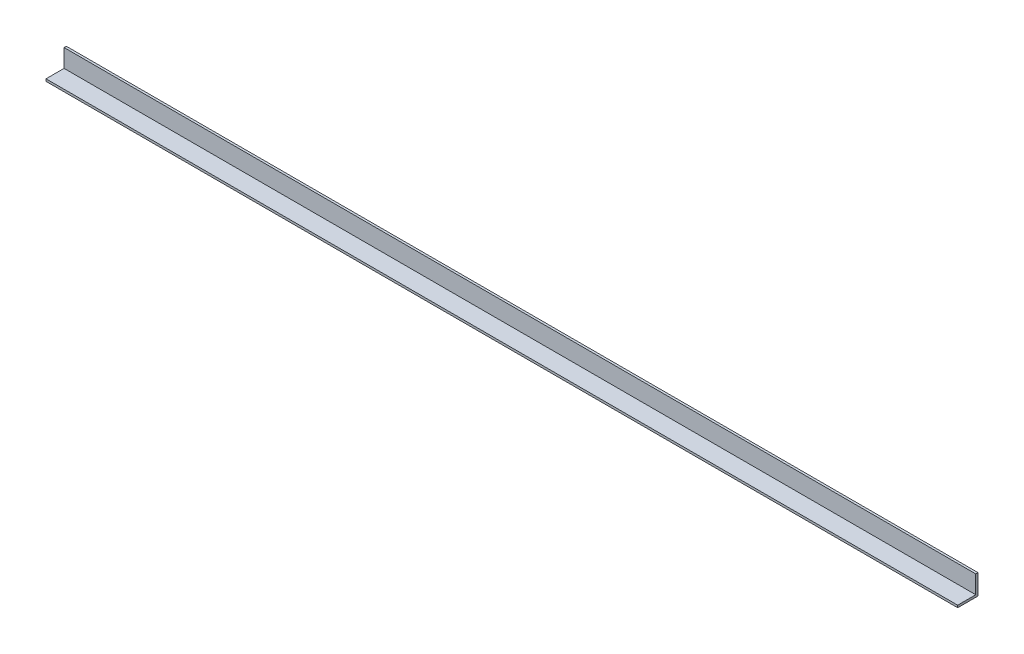
ISO-10303-21;
HEADER;
FILE_DESCRIPTION(('STEP AP214'),'2;1');
FILE_NAME('part.step','',(''),(''),'','','');
FILE_SCHEMA(('AUTOMOTIVE_DESIGN { 1 0 10303 214 1 1 1 1 }'));
ENDSEC;
DATA;
#1=APPLICATION_CONTEXT('core data for automotive mechanical design processes');
#2=APPLICATION_PROTOCOL_DEFINITION('international standard','automotive_design',2000,#1);
#3=PRODUCT_CONTEXT('',#1,'mechanical');
#4=PRODUCT('Part','Part','',(#3));
#5=PRODUCT_RELATED_PRODUCT_CATEGORY('part','',(#4));
#6=PRODUCT_DEFINITION_FORMATION('','',#4);
#7=PRODUCT_DEFINITION_CONTEXT('part definition',#1,'design');
#8=PRODUCT_DEFINITION('design','',#6,#7);
#9=PRODUCT_DEFINITION_SHAPE('','',#8);
#10=(LENGTH_UNIT() NAMED_UNIT(*) SI_UNIT(.MILLI.,.METRE.));
#11=(NAMED_UNIT(*) PLANE_ANGLE_UNIT() SI_UNIT($,.RADIAN.));
#12=(NAMED_UNIT(*) SI_UNIT($,.STERADIAN.) SOLID_ANGLE_UNIT());
#13=UNCERTAINTY_MEASURE_WITH_UNIT(LENGTH_MEASURE(1.E-05),#10,'distance_accuracy_value','');
#14=(GEOMETRIC_REPRESENTATION_CONTEXT(3) GLOBAL_UNCERTAINTY_ASSIGNED_CONTEXT((#13)) GLOBAL_UNIT_ASSIGNED_CONTEXT((#10,
#11,#12)) REPRESENTATION_CONTEXT('',''));
#15=CARTESIAN_POINT('',(0.,0.,0.));
#16=DIRECTION('',(0.,0.,1.));
#17=DIRECTION('',(1.,0.,0.));
#18=AXIS2_PLACEMENT_3D('',#15,#16,#17);
#19=CARTESIAN_POINT('',(505.,2.5,-11.25));
#20=DIRECTION('',(-1.,0.,0.));
#21=DIRECTION('',(0.,0.,1.));
#22=AXIS2_PLACEMENT_3D('',#19,#20,#21);
#23=PLANE('',#22);
#24=DIRECTION('',(0.,0.,-1.));
#25=VECTOR('',#24,1.);
#26=CARTESIAN_POINT('',(505.,0.,-11.25));
#27=LINE('',#26,#25);
#28=CARTESIAN_POINT('',(505.,0.,11.25));
#29=VERTEX_POINT('',#28);
#30=CARTESIAN_POINT('',(505.,0.,-11.25));
#31=VERTEX_POINT('',#30);
#32=EDGE_CURVE('E88',#29,#31,#27,.T.);
#33=ORIENTED_EDGE('',*,*,#32,.T.);
#34=DIRECTION('',(0.,-1.,0.));
#35=VECTOR('',#34,1.);
#36=CARTESIAN_POINT('',(505.,2.5,-11.25));
#37=LINE('',#36,#35);
#38=CARTESIAN_POINT('',(505.,22.5,-11.25));
#39=VERTEX_POINT('',#38);
#40=EDGE_CURVE('E11',#39,#31,#37,.T.);
#41=ORIENTED_EDGE('',*,*,#40,.F.);
#42=DIRECTION('',(0.,0.,-1.));
#43=VECTOR('',#42,1.);
#44=CARTESIAN_POINT('',(505.,22.5,-11.25));
#45=LINE('',#44,#43);
#46=CARTESIAN_POINT('',(505.,22.5,-8.75));
#47=VERTEX_POINT('',#46);
#48=EDGE_CURVE('E124',#47,#39,#45,.T.);
#49=ORIENTED_EDGE('',*,*,#48,.F.);
#50=DIRECTION('',(0.,-1.,0.));
#51=VECTOR('',#50,1.);
#52=CARTESIAN_POINT('',(505.,22.5,-8.75));
#53=LINE('',#52,#51);
#54=CARTESIAN_POINT('',(505.,2.5,-8.75));
#55=VERTEX_POINT('',#54);
#56=EDGE_CURVE('E97',#47,#55,#53,.T.);
#57=ORIENTED_EDGE('',*,*,#56,.T.);
#58=DIRECTION('',(0.,0.,-1.));
#59=VECTOR('',#58,1.);
#60=CARTESIAN_POINT('',(505.,2.5,-11.25));
#61=LINE('',#60,#59);
#62=CARTESIAN_POINT('',(505.,2.5,11.25));
#63=VERTEX_POINT('',#62);
#64=EDGE_CURVE('E82',#63,#55,#61,.T.);
#65=ORIENTED_EDGE('',*,*,#64,.F.);
#66=DIRECTION('',(0.,-1.,0.));
#67=VECTOR('',#66,1.);
#68=CARTESIAN_POINT('',(505.,2.5,11.25));
#69=LINE('',#68,#67);
#70=EDGE_CURVE('E75',#63,#29,#69,.T.);
#71=ORIENTED_EDGE('',*,*,#70,.T.);
#72=EDGE_LOOP('',(#33,#41,#49,#57,#65,#71));
#73=FACE_BOUND('',#72,.T.);
#74=ADVANCED_FACE('F33',(#73),#23,.F.);
#75=CARTESIAN_POINT('',(-505.,2.5,-11.25));
#76=DIRECTION('',(0.,0.,1.));
#77=DIRECTION('',(1.,0.,0.));
#78=AXIS2_PLACEMENT_3D('',#75,#76,#77);
#79=PLANE('',#78);
#80=DIRECTION('',(-1.,0.,0.));
#81=VECTOR('',#80,1.);
#82=CARTESIAN_POINT('',(-505.,0.,-11.25));
#83=LINE('',#82,#81);
#84=CARTESIAN_POINT('',(-505.,0.,-11.25));
#85=VERTEX_POINT('',#84);
#86=EDGE_CURVE('E92',#31,#85,#83,.T.);
#87=ORIENTED_EDGE('',*,*,#86,.T.);
#88=DIRECTION('',(0.,-1.,0.));
#89=VECTOR('',#88,1.);
#90=CARTESIAN_POINT('',(-505.,2.5,-11.25));
#91=LINE('',#90,#89);
#92=CARTESIAN_POINT('',(-505.,22.5,-11.25));
#93=VERTEX_POINT('',#92);
#94=EDGE_CURVE('E40',#93,#85,#91,.T.);
#95=ORIENTED_EDGE('',*,*,#94,.F.);
#96=DIRECTION('',(-1.,0.,0.));
#97=VECTOR('',#96,1.);
#98=CARTESIAN_POINT('',(-505.,22.5,-11.25));
#99=LINE('',#98,#97);
#100=EDGE_CURVE('E116',#39,#93,#99,.T.);
#101=ORIENTED_EDGE('',*,*,#100,.F.);
#102=ORIENTED_EDGE('',*,*,#40,.T.);
#103=EDGE_LOOP('',(#87,#95,#101,#102));
#104=FACE_BOUND('',#103,.T.);
#105=ADVANCED_FACE('F114',(#104),#79,.F.);
#106=CARTESIAN_POINT('',(-505.,2.5,-11.25));
#107=DIRECTION('',(1.,0.,0.));
#108=DIRECTION('',(0.,0.,-1.));
#109=AXIS2_PLACEMENT_3D('',#106,#107,#108);
#110=PLANE('',#109);
#111=DIRECTION('',(0.,0.,1.));
#112=VECTOR('',#111,1.);
#113=CARTESIAN_POINT('',(-505.,0.,-11.25));
#114=LINE('',#113,#112);
#115=CARTESIAN_POINT('',(-505.,0.,11.25));
#116=VERTEX_POINT('',#115);
#117=EDGE_CURVE('E83',#85,#116,#114,.T.);
#118=ORIENTED_EDGE('',*,*,#117,.T.);
#119=DIRECTION('',(0.,-1.,0.));
#120=VECTOR('',#119,1.);
#121=CARTESIAN_POINT('',(-505.,2.5,11.25));
#122=LINE('',#121,#120);
#123=CARTESIAN_POINT('',(-505.,2.5,11.25));
#124=VERTEX_POINT('',#123);
#125=EDGE_CURVE('E78',#124,#116,#122,.T.);
#126=ORIENTED_EDGE('',*,*,#125,.F.);
#127=DIRECTION('',(0.,0.,1.));
#128=VECTOR('',#127,1.);
#129=CARTESIAN_POINT('',(-505.,2.5,-11.25));
#130=LINE('',#129,#128);
#131=CARTESIAN_POINT('',(-505.,2.5,-8.75));
#132=VERTEX_POINT('',#131);
#133=EDGE_CURVE('E132',#132,#124,#130,.T.);
#134=ORIENTED_EDGE('',*,*,#133,.F.);
#135=DIRECTION('',(0.,-1.,0.));
#136=VECTOR('',#135,1.);
#137=CARTESIAN_POINT('',(-505.,22.5,-8.75));
#138=LINE('',#137,#136);
#139=CARTESIAN_POINT('',(-505.,22.5,-8.75));
#140=VERTEX_POINT('',#139);
#141=EDGE_CURVE('E93',#140,#132,#138,.T.);
#142=ORIENTED_EDGE('',*,*,#141,.F.);
#143=DIRECTION('',(0.,0.,1.));
#144=VECTOR('',#143,1.);
#145=CARTESIAN_POINT('',(-505.,22.5,-11.25));
#146=LINE('',#145,#144);
#147=EDGE_CURVE('E110',#93,#140,#146,.T.);
#148=ORIENTED_EDGE('',*,*,#147,.F.);
#149=ORIENTED_EDGE('',*,*,#94,.T.);
#150=EDGE_LOOP('',(#118,#126,#134,#142,#148,#149));
#151=FACE_BOUND('',#150,.T.);
#152=ADVANCED_FACE('F107',(#151),#110,.F.);
#153=CARTESIAN_POINT('',(-505.,2.5,11.25));
#154=DIRECTION('',(0.,0.,-1.));
#155=DIRECTION('',(-1.,0.,0.));
#156=AXIS2_PLACEMENT_3D('',#153,#154,#155);
#157=PLANE('',#156);
#158=DIRECTION('',(1.,0.,0.));
#159=VECTOR('',#158,1.);
#160=CARTESIAN_POINT('',(-505.,0.,11.25));
#161=LINE('',#160,#159);
#162=EDGE_CURVE('E72',#116,#29,#161,.T.);
#163=ORIENTED_EDGE('',*,*,#162,.T.);
#164=ORIENTED_EDGE('',*,*,#70,.F.);
#165=DIRECTION('',(1.,0.,0.));
#166=VECTOR('',#165,1.);
#167=CARTESIAN_POINT('',(-505.,2.5,11.25));
#168=LINE('',#167,#166);
#169=EDGE_CURVE('E53',#124,#63,#168,.T.);
#170=ORIENTED_EDGE('',*,*,#169,.F.);
#171=ORIENTED_EDGE('',*,*,#125,.T.);
#172=EDGE_LOOP('',(#163,#164,#170,#171));
#173=FACE_BOUND('',#172,.T.);
#174=ADVANCED_FACE('F74',(#173),#157,.F.);
#175=CARTESIAN_POINT('',(0.,2.5,0.));
#176=DIRECTION('',(0.,1.,0.));
#177=DIRECTION('',(0.,0.,1.));
#178=AXIS2_PLACEMENT_3D('',#175,#176,#177);
#179=PLANE('',#178);
#180=DIRECTION('',(1.,0.,0.));
#181=VECTOR('',#180,1.);
#182=CARTESIAN_POINT('',(-505.,2.5,-8.75));
#183=LINE('',#182,#181);
#184=EDGE_CURVE('E47',#132,#55,#183,.T.);
#185=ORIENTED_EDGE('',*,*,#184,.F.);
#186=ORIENTED_EDGE('',*,*,#133,.T.);
#187=ORIENTED_EDGE('',*,*,#169,.T.);
#188=ORIENTED_EDGE('',*,*,#64,.T.);
#189=EDGE_LOOP('',(#185,#186,#187,#188));
#190=FACE_BOUND('',#189,.T.);
#191=ADVANCED_FACE('F133',(#190),#179,.T.);
#192=CARTESIAN_POINT('',(0.,0.,0.));
#193=DIRECTION('',(0.,1.,0.));
#194=DIRECTION('',(0.,0.,1.));
#195=AXIS2_PLACEMENT_3D('',#192,#193,#194);
#196=PLANE('',#195);
#197=ORIENTED_EDGE('',*,*,#32,.F.);
#198=ORIENTED_EDGE('',*,*,#162,.F.);
#199=ORIENTED_EDGE('',*,*,#117,.F.);
#200=ORIENTED_EDGE('',*,*,#86,.F.);
#201=EDGE_LOOP('',(#197,#198,#199,#200));
#202=FACE_BOUND('',#201,.T.);
#203=ADVANCED_FACE('F91',(#202),#196,.F.);
#204=CARTESIAN_POINT('',(-505.,22.5,-8.75));
#205=DIRECTION('',(0.,0.,-1.));
#206=DIRECTION('',(-1.,0.,0.));
#207=AXIS2_PLACEMENT_3D('',#204,#205,#206);
#208=PLANE('',#207);
#209=ORIENTED_EDGE('',*,*,#184,.T.);
#210=ORIENTED_EDGE('',*,*,#56,.F.);
#211=DIRECTION('',(1.,0.,0.));
#212=VECTOR('',#211,1.);
#213=CARTESIAN_POINT('',(-505.,22.5,-8.75));
#214=LINE('',#213,#212);
#215=EDGE_CURVE('E127',#140,#47,#214,.T.);
#216=ORIENTED_EDGE('',*,*,#215,.F.);
#217=ORIENTED_EDGE('',*,*,#141,.T.);
#218=EDGE_LOOP('',(#209,#210,#216,#217));
#219=FACE_BOUND('',#218,.T.);
#220=ADVANCED_FACE('F136',(#219),#208,.F.);
#221=CARTESIAN_POINT('',(0.,22.5,0.));
#222=DIRECTION('',(0.,1.,0.));
#223=DIRECTION('',(0.,0.,1.));
#224=AXIS2_PLACEMENT_3D('',#221,#222,#223);
#225=PLANE('',#224);
#226=ORIENTED_EDGE('',*,*,#147,.T.);
#227=ORIENTED_EDGE('',*,*,#215,.T.);
#228=ORIENTED_EDGE('',*,*,#48,.T.);
#229=ORIENTED_EDGE('',*,*,#100,.T.);
#230=EDGE_LOOP('',(#226,#227,#228,#229));
#231=FACE_BOUND('',#230,.T.);
#232=ADVANCED_FACE('F120',(#231),#225,.T.);
#233=CLOSED_SHELL('',(#74,#105,#152,#174,#191,#203,#220,#232));
#234=MANIFOLD_SOLID_BREP('B2',#233);
#235=ADVANCED_BREP_SHAPE_REPRESENTATION('',(#18,#234),#14);
#236=SHAPE_DEFINITION_REPRESENTATION(#9,#235);
ENDSEC;
END-ISO-10303-21;
